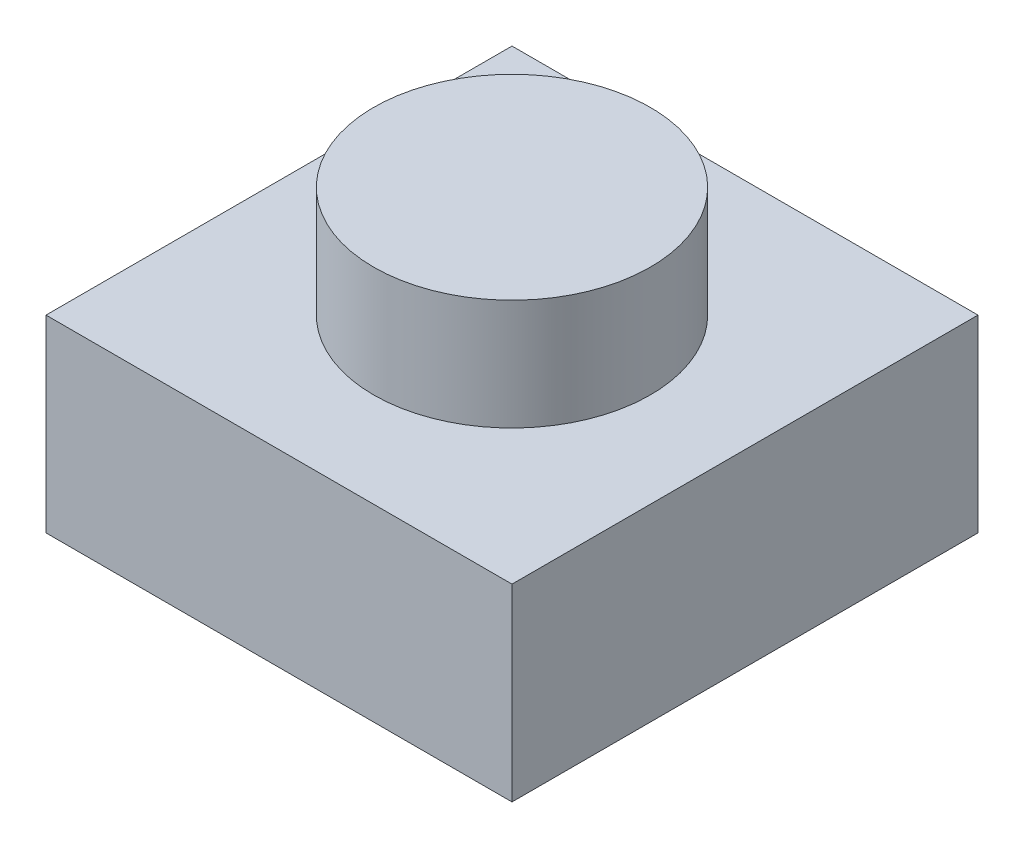
ISO-10303-21;
HEADER;
FILE_DESCRIPTION(('STEP AP214'),'2;1');
FILE_NAME('part.step','',(''),(''),'','','');
FILE_SCHEMA(('AUTOMOTIVE_DESIGN { 1 0 10303 214 1 1 1 1 }'));
ENDSEC;
DATA;
#1=APPLICATION_CONTEXT('core data for automotive mechanical design processes');
#2=APPLICATION_PROTOCOL_DEFINITION('international standard','automotive_design',2000,#1);
#3=PRODUCT_CONTEXT('',#1,'mechanical');
#4=PRODUCT('Part','Part','',(#3));
#5=PRODUCT_RELATED_PRODUCT_CATEGORY('part','',(#4));
#6=PRODUCT_DEFINITION_FORMATION('','',#4);
#7=PRODUCT_DEFINITION_CONTEXT('part definition',#1,'design');
#8=PRODUCT_DEFINITION('design','',#6,#7);
#9=PRODUCT_DEFINITION_SHAPE('','',#8);
#10=(LENGTH_UNIT() NAMED_UNIT(*) SI_UNIT(.MILLI.,.METRE.));
#11=(NAMED_UNIT(*) PLANE_ANGLE_UNIT() SI_UNIT($,.RADIAN.));
#12=(NAMED_UNIT(*) SI_UNIT($,.STERADIAN.) SOLID_ANGLE_UNIT());
#13=UNCERTAINTY_MEASURE_WITH_UNIT(LENGTH_MEASURE(1.E-05),#10,'distance_accuracy_value','');
#14=(GEOMETRIC_REPRESENTATION_CONTEXT(3) GLOBAL_UNCERTAINTY_ASSIGNED_CONTEXT((#13)) GLOBAL_UNIT_ASSIGNED_CONTEXT((#10,
#11,#12)) REPRESENTATION_CONTEXT('',''));
#15=CARTESIAN_POINT('',(0.,0.,0.));
#16=DIRECTION('',(0.,0.,1.));
#17=DIRECTION('',(1.,0.,0.));
#18=AXIS2_PLACEMENT_3D('',#15,#16,#17);
#19=CARTESIAN_POINT('',(3.915,-3.17,-3.91500000000003));
#20=DIRECTION('',(1.,0.,0.));
#21=DIRECTION('',(0.,0.,-1.));
#22=AXIS2_PLACEMENT_3D('',#19,#20,#21);
#23=PLANE('',#22);
#24=DIRECTION('',(0.,0.,-1.));
#25=VECTOR('',#24,1.);
#26=CARTESIAN_POINT('',(3.915,0.,-3.91500000000003));
#27=LINE('',#26,#25);
#28=CARTESIAN_POINT('',(3.91499999999997,0.,3.91499999999997));
#29=VERTEX_POINT('',#28);
#30=CARTESIAN_POINT('',(3.915,0.,-3.91500000000003));
#31=VERTEX_POINT('',#30);
#32=EDGE_CURVE('E154',#29,#31,#27,.T.);
#33=ORIENTED_EDGE('',*,*,#32,.F.);
#34=DIRECTION('',(0.,1.,0.));
#35=VECTOR('',#34,1.);
#36=CARTESIAN_POINT('',(3.91499999999997,-3.17,3.91499999999997));
#37=LINE('',#36,#35);
#38=CARTESIAN_POINT('',(3.91499999999997,-3.17,3.91499999999997));
#39=VERTEX_POINT('',#38);
#40=EDGE_CURVE('E41',#39,#29,#37,.T.);
#41=ORIENTED_EDGE('',*,*,#40,.F.);
#42=DIRECTION('',(0.,0.,-1.));
#43=VECTOR('',#42,1.);
#44=CARTESIAN_POINT('',(3.915,-3.17,-3.91500000000003));
#45=LINE('',#44,#43);
#46=CARTESIAN_POINT('',(3.915,-3.17,-3.91500000000003));
#47=VERTEX_POINT('',#46);
#48=EDGE_CURVE('E156',#39,#47,#45,.T.);
#49=ORIENTED_EDGE('',*,*,#48,.T.);
#50=DIRECTION('',(0.,1.,0.));
#51=VECTOR('',#50,1.);
#52=CARTESIAN_POINT('',(3.915,-3.17,-3.91500000000003));
#53=LINE('',#52,#51);
#54=EDGE_CURVE('E36',#47,#31,#53,.T.);
#55=ORIENTED_EDGE('',*,*,#54,.T.);
#56=EDGE_LOOP('',(#33,#41,#49,#55));
#57=FACE_BOUND('',#56,.T.);
#58=ADVANCED_FACE('F33',(#57),#23,.T.);
#59=CARTESIAN_POINT('',(-3.91500000000003,-3.17,3.91499999999997));
#60=DIRECTION('',(0.,0.,1.));
#61=DIRECTION('',(1.,0.,0.));
#62=AXIS2_PLACEMENT_3D('',#59,#60,#61);
#63=PLANE('',#62);
#64=DIRECTION('',(1.,0.,0.));
#65=VECTOR('',#64,1.);
#66=CARTESIAN_POINT('',(-3.91500000000003,0.,3.91499999999997));
#67=LINE('',#66,#65);
#68=CARTESIAN_POINT('',(-3.91500000000003,0.,3.91499999999997));
#69=VERTEX_POINT('',#68);
#70=EDGE_CURVE('E159',#69,#29,#67,.T.);
#71=ORIENTED_EDGE('',*,*,#70,.F.);
#72=DIRECTION('',(0.,1.,0.));
#73=VECTOR('',#72,1.);
#74=CARTESIAN_POINT('',(-3.91500000000003,-3.17,3.91499999999997));
#75=LINE('',#74,#73);
#76=CARTESIAN_POINT('',(-3.91500000000003,-3.17,3.91499999999997));
#77=VERTEX_POINT('',#76);
#78=EDGE_CURVE('E177',#77,#69,#75,.T.);
#79=ORIENTED_EDGE('',*,*,#78,.F.);
#80=DIRECTION('',(1.,0.,0.));
#81=VECTOR('',#80,1.);
#82=CARTESIAN_POINT('',(-3.91500000000003,-3.17,3.91499999999997));
#83=LINE('',#82,#81);
#84=EDGE_CURVE('E164',#77,#39,#83,.T.);
#85=ORIENTED_EDGE('',*,*,#84,.T.);
#86=ORIENTED_EDGE('',*,*,#40,.T.);
#87=EDGE_LOOP('',(#71,#79,#85,#86));
#88=FACE_BOUND('',#87,.T.);
#89=ADVANCED_FACE('F183',(#88),#63,.T.);
#90=CARTESIAN_POINT('',(-3.91500000000003,-3.17,-3.91500000000003));
#91=DIRECTION('',(-1.,0.,0.));
#92=DIRECTION('',(0.,0.,1.));
#93=AXIS2_PLACEMENT_3D('',#90,#91,#92);
#94=PLANE('',#93);
#95=DIRECTION('',(0.,0.,1.));
#96=VECTOR('',#95,1.);
#97=CARTESIAN_POINT('',(-3.91500000000003,0.,-3.91500000000003));
#98=LINE('',#97,#96);
#99=CARTESIAN_POINT('',(-3.91500000000003,0.,-3.91500000000003));
#100=VERTEX_POINT('',#99);
#101=EDGE_CURVE('E171',#100,#69,#98,.T.);
#102=ORIENTED_EDGE('',*,*,#101,.F.);
#103=DIRECTION('',(0.,1.,0.));
#104=VECTOR('',#103,1.);
#105=CARTESIAN_POINT('',(-3.91500000000003,-3.17,-3.91500000000003));
#106=LINE('',#105,#104);
#107=CARTESIAN_POINT('',(-3.91500000000003,-3.17,-3.91500000000003));
#108=VERTEX_POINT('',#107);
#109=EDGE_CURVE('E178',#108,#100,#106,.T.);
#110=ORIENTED_EDGE('',*,*,#109,.F.);
#111=DIRECTION('',(0.,0.,1.));
#112=VECTOR('',#111,1.);
#113=CARTESIAN_POINT('',(-3.91500000000003,-3.17,-3.91500000000003));
#114=LINE('',#113,#112);
#115=EDGE_CURVE('E161',#108,#77,#114,.T.);
#116=ORIENTED_EDGE('',*,*,#115,.T.);
#117=ORIENTED_EDGE('',*,*,#78,.T.);
#118=EDGE_LOOP('',(#102,#110,#116,#117));
#119=FACE_BOUND('',#118,.T.);
#120=ADVANCED_FACE('F187',(#119),#94,.T.);
#121=CARTESIAN_POINT('',(-3.91500000000003,-3.17,-3.91500000000003));
#122=DIRECTION('',(0.,0.,-1.));
#123=DIRECTION('',(-1.,0.,0.));
#124=AXIS2_PLACEMENT_3D('',#121,#122,#123);
#125=PLANE('',#124);
#126=DIRECTION('',(-1.,0.,0.));
#127=VECTOR('',#126,1.);
#128=CARTESIAN_POINT('',(-3.91500000000003,0.,-3.91500000000003));
#129=LINE('',#128,#127);
#130=EDGE_CURVE('E168',#31,#100,#129,.T.);
#131=ORIENTED_EDGE('',*,*,#130,.F.);
#132=ORIENTED_EDGE('',*,*,#54,.F.);
#133=DIRECTION('',(-1.,0.,0.));
#134=VECTOR('',#133,1.);
#135=CARTESIAN_POINT('',(-3.91500000000003,-3.17,-3.91500000000003));
#136=LINE('',#135,#134);
#137=EDGE_CURVE('E158',#47,#108,#136,.T.);
#138=ORIENTED_EDGE('',*,*,#137,.T.);
#139=ORIENTED_EDGE('',*,*,#109,.T.);
#140=EDGE_LOOP('',(#131,#132,#138,#139));
#141=FACE_BOUND('',#140,.T.);
#142=ADVANCED_FACE('F180',(#141),#125,.T.);
#143=CARTESIAN_POINT('',(0.,-3.17,0.));
#144=DIRECTION('',(0.,1.,0.));
#145=DIRECTION('',(0.,0.,1.));
#146=AXIS2_PLACEMENT_3D('',#143,#144,#145);
#147=PLANE('',#146);
#148=DIRECTION('',(1.,0.,0.));
#149=VECTOR('',#148,1.);
#150=CARTESIAN_POINT('',(0.,-3.17,2.46499999999997));
#151=LINE('',#150,#149);
#152=CARTESIAN_POINT('',(-2.46500000000003,-3.17,2.46499999999997));
#153=VERTEX_POINT('',#152);
#154=CARTESIAN_POINT('',(2.46499999999998,-3.17,2.46499999999997));
#155=VERTEX_POINT('',#154);
#156=EDGE_CURVE('E148',#153,#155,#151,.T.);
#157=ORIENTED_EDGE('',*,*,#156,.T.);
#158=DIRECTION('',(0.,0.,-1.));
#159=VECTOR('',#158,1.);
#160=CARTESIAN_POINT('',(2.46499999999999,-3.17,0.));
#161=LINE('',#160,#159);
#162=CARTESIAN_POINT('',(2.465,-3.17,-2.46500000000003));
#163=VERTEX_POINT('',#162);
#164=EDGE_CURVE('E111',#155,#163,#161,.T.);
#165=ORIENTED_EDGE('',*,*,#164,.T.);
#166=DIRECTION('',(-1.,0.,0.));
#167=VECTOR('',#166,1.);
#168=CARTESIAN_POINT('',(0.,-3.17,-2.46500000000003));
#169=LINE('',#168,#167);
#170=CARTESIAN_POINT('',(-2.46500000000003,-3.17,-2.46500000000003));
#171=VERTEX_POINT('',#170);
#172=EDGE_CURVE('E133',#163,#171,#169,.T.);
#173=ORIENTED_EDGE('',*,*,#172,.T.);
#174=DIRECTION('',(0.,0.,1.));
#175=VECTOR('',#174,1.);
#176=CARTESIAN_POINT('',(-2.46500000000003,-3.17,0.));
#177=LINE('',#176,#175);
#178=EDGE_CURVE('E49',#171,#153,#177,.T.);
#179=ORIENTED_EDGE('',*,*,#178,.T.);
#180=EDGE_LOOP('',(#157,#165,#173,#179));
#181=FACE_BOUND('',#180,.T.);
#182=ORIENTED_EDGE('',*,*,#48,.F.);
#183=ORIENTED_EDGE('',*,*,#84,.F.);
#184=ORIENTED_EDGE('',*,*,#115,.F.);
#185=ORIENTED_EDGE('',*,*,#137,.F.);
#186=EDGE_LOOP('',(#182,#183,#184,#185));
#187=FACE_BOUND('',#186,.T.);
#188=ADVANCED_FACE('F189',(#181,#187),#147,.F.);
#189=CARTESIAN_POINT('',(0.,0.,0.));
#190=DIRECTION('',(0.,1.,0.));
#191=DIRECTION('',(0.,0.,1.));
#192=AXIS2_PLACEMENT_3D('',#189,#190,#191);
#193=PLANE('',#192);
#194=CARTESIAN_POINT('',(0.,0.,0.));
#195=DIRECTION('',(0.,1.,0.));
#196=DIRECTION('',(0.,0.,1.));
#197=AXIS2_PLACEMENT_3D('',#194,#195,#196);
#198=CIRCLE('',#197,2.325);
#199=CARTESIAN_POINT('',(0.,0.,2.325));
#200=VERTEX_POINT('',#199);
#201=EDGE_CURVE('E11',#200,#200,#198,.T.);
#202=ORIENTED_EDGE('',*,*,#201,.F.);
#203=EDGE_LOOP('',(#202));
#204=FACE_BOUND('',#203,.T.);
#205=ORIENTED_EDGE('',*,*,#32,.T.);
#206=ORIENTED_EDGE('',*,*,#130,.T.);
#207=ORIENTED_EDGE('',*,*,#101,.T.);
#208=ORIENTED_EDGE('',*,*,#70,.T.);
#209=EDGE_LOOP('',(#205,#206,#207,#208));
#210=FACE_BOUND('',#209,.T.);
#211=ADVANCED_FACE('F182',(#204,#210),#193,.T.);
#212=CARTESIAN_POINT('',(0.,1.86,0.));
#213=DIRECTION('',(0.,-1.,0.));
#214=DIRECTION('',(0.,0.,-1.));
#215=AXIS2_PLACEMENT_3D('',#212,#213,#214);
#216=CYLINDRICAL_SURFACE('',#215,2.325);
#217=CARTESIAN_POINT('',(0.,1.86,0.));
#218=DIRECTION('',(0.,1.,0.));
#219=DIRECTION('',(0.,0.,1.));
#220=AXIS2_PLACEMENT_3D('',#217,#218,#219);
#221=CIRCLE('',#220,2.325);
#222=CARTESIAN_POINT('',(0.,1.86,2.325));
#223=VERTEX_POINT('',#222);
#224=EDGE_CURVE('E145',#223,#223,#221,.T.);
#225=ORIENTED_EDGE('',*,*,#224,.F.);
#226=EDGE_LOOP('',(#225));
#227=FACE_BOUND('',#226,.T.);
#228=ORIENTED_EDGE('',*,*,#201,.T.);
#229=EDGE_LOOP('',(#228));
#230=FACE_BOUND('',#229,.T.);
#231=ADVANCED_FACE('F197',(#227,#230),#216,.T.);
#232=CARTESIAN_POINT('',(0.,1.86,0.));
#233=DIRECTION('',(0.,1.,0.));
#234=DIRECTION('',(0.,0.,1.));
#235=AXIS2_PLACEMENT_3D('',#232,#233,#234);
#236=PLANE('',#235);
#237=ORIENTED_EDGE('',*,*,#224,.T.);
#238=EDGE_LOOP('',(#237));
#239=FACE_BOUND('',#238,.T.);
#240=ADVANCED_FACE('F232',(#239),#236,.T.);
#241=CARTESIAN_POINT('',(2.465,-3.17,-3.91500000000003));
#242=DIRECTION('',(1.,0.,0.));
#243=DIRECTION('',(0.,0.,-1.));
#244=AXIS2_PLACEMENT_3D('',#241,#242,#243);
#245=PLANE('',#244);
#246=DIRECTION('',(0.,0.,-1.));
#247=VECTOR('',#246,1.);
#248=CARTESIAN_POINT('',(2.46499999999999,-1.45,0.));
#249=LINE('',#248,#247);
#250=CARTESIAN_POINT('',(2.46499999999998,-1.45,2.46499999999997));
#251=VERTEX_POINT('',#250);
#252=CARTESIAN_POINT('',(2.465,-1.45,-2.46500000000003));
#253=VERTEX_POINT('',#252);
#254=EDGE_CURVE('E109',#251,#253,#249,.T.);
#255=ORIENTED_EDGE('',*,*,#254,.T.);
#256=DIRECTION('',(0.,1.,0.));
#257=VECTOR('',#256,1.);
#258=CARTESIAN_POINT('',(2.465,-3.17,-2.46500000000003));
#259=LINE('',#258,#257);
#260=EDGE_CURVE('E138',#163,#253,#259,.T.);
#261=ORIENTED_EDGE('',*,*,#260,.F.);
#262=ORIENTED_EDGE('',*,*,#164,.F.);
#263=DIRECTION('',(0.,1.,0.));
#264=VECTOR('',#263,1.);
#265=CARTESIAN_POINT('',(2.46499999999998,-3.17,2.46499999999997));
#266=LINE('',#265,#264);
#267=EDGE_CURVE('E106',#155,#251,#266,.T.);
#268=ORIENTED_EDGE('',*,*,#267,.T.);
#269=EDGE_LOOP('',(#255,#261,#262,#268));
#270=FACE_BOUND('',#269,.T.);
#271=ADVANCED_FACE('F108',(#270),#245,.F.);
#272=CARTESIAN_POINT('',(-3.91500000000003,-3.17,2.46499999999997));
#273=DIRECTION('',(0.,0.,1.));
#274=DIRECTION('',(1.,0.,0.));
#275=AXIS2_PLACEMENT_3D('',#272,#273,#274);
#276=PLANE('',#275);
#277=DIRECTION('',(1.,0.,0.));
#278=VECTOR('',#277,1.);
#279=CARTESIAN_POINT('',(0.,-1.45,2.46499999999997));
#280=LINE('',#279,#278);
#281=CARTESIAN_POINT('',(-2.46500000000003,-1.45,2.46499999999997));
#282=VERTEX_POINT('',#281);
#283=EDGE_CURVE('E124',#282,#251,#280,.T.);
#284=ORIENTED_EDGE('',*,*,#283,.T.);
#285=ORIENTED_EDGE('',*,*,#267,.F.);
#286=ORIENTED_EDGE('',*,*,#156,.F.);
#287=DIRECTION('',(0.,1.,0.));
#288=VECTOR('',#287,1.);
#289=CARTESIAN_POINT('',(-2.46500000000003,-3.17,2.46499999999997));
#290=LINE('',#289,#288);
#291=EDGE_CURVE('E117',#153,#282,#290,.T.);
#292=ORIENTED_EDGE('',*,*,#291,.T.);
#293=EDGE_LOOP('',(#284,#285,#286,#292));
#294=FACE_BOUND('',#293,.T.);
#295=ADVANCED_FACE('F129',(#294),#276,.F.);
#296=CARTESIAN_POINT('',(-2.46500000000003,-3.17,-3.91500000000003));
#297=DIRECTION('',(-1.,0.,0.));
#298=DIRECTION('',(0.,0.,1.));
#299=AXIS2_PLACEMENT_3D('',#296,#297,#298);
#300=PLANE('',#299);
#301=DIRECTION('',(0.,0.,1.));
#302=VECTOR('',#301,1.);
#303=CARTESIAN_POINT('',(-2.46500000000003,-1.45,0.));
#304=LINE('',#303,#302);
#305=CARTESIAN_POINT('',(-2.46500000000003,-1.45,-2.46500000000003));
#306=VERTEX_POINT('',#305);
#307=EDGE_CURVE('E131',#306,#282,#304,.T.);
#308=ORIENTED_EDGE('',*,*,#307,.T.);
#309=ORIENTED_EDGE('',*,*,#291,.F.);
#310=ORIENTED_EDGE('',*,*,#178,.F.);
#311=DIRECTION('',(0.,1.,0.));
#312=VECTOR('',#311,1.);
#313=CARTESIAN_POINT('',(-2.46500000000003,-3.17,-2.46500000000003));
#314=LINE('',#313,#312);
#315=EDGE_CURVE('E139',#171,#306,#314,.T.);
#316=ORIENTED_EDGE('',*,*,#315,.T.);
#317=EDGE_LOOP('',(#308,#309,#310,#316));
#318=FACE_BOUND('',#317,.T.);
#319=ADVANCED_FACE('F261',(#318),#300,.F.);
#320=CARTESIAN_POINT('',(-3.91500000000003,-3.17,-2.46500000000003));
#321=DIRECTION('',(0.,0.,-1.));
#322=DIRECTION('',(-1.,0.,0.));
#323=AXIS2_PLACEMENT_3D('',#320,#321,#322);
#324=PLANE('',#323);
#325=DIRECTION('',(-1.,0.,0.));
#326=VECTOR('',#325,1.);
#327=CARTESIAN_POINT('',(0.,-1.45,-2.46500000000003));
#328=LINE('',#327,#326);
#329=EDGE_CURVE('E126',#253,#306,#328,.T.);
#330=ORIENTED_EDGE('',*,*,#329,.T.);
#331=ORIENTED_EDGE('',*,*,#315,.F.);
#332=ORIENTED_EDGE('',*,*,#172,.F.);
#333=ORIENTED_EDGE('',*,*,#260,.T.);
#334=EDGE_LOOP('',(#330,#331,#332,#333));
#335=FACE_BOUND('',#334,.T.);
#336=ADVANCED_FACE('F270',(#335),#324,.F.);
#337=CARTESIAN_POINT('',(0.,-1.45,0.));
#338=DIRECTION('',(0.,1.,0.));
#339=DIRECTION('',(0.,0.,1.));
#340=AXIS2_PLACEMENT_3D('',#337,#338,#339);
#341=PLANE('',#340);
#342=CARTESIAN_POINT('',(0.,-1.45,0.));
#343=DIRECTION('',(0.,1.,0.));
#344=DIRECTION('',(0.,0.,1.));
#345=AXIS2_PLACEMENT_3D('',#342,#343,#344);
#346=CIRCLE('',#345,0.875);
#347=CARTESIAN_POINT('',(0.,-1.45,0.875));
#348=VERTEX_POINT('',#347);
#349=EDGE_CURVE('E116',#348,#348,#346,.T.);
#350=ORIENTED_EDGE('',*,*,#349,.T.);
#351=EDGE_LOOP('',(#350));
#352=FACE_BOUND('',#351,.T.);
#353=ORIENTED_EDGE('',*,*,#254,.F.);
#354=ORIENTED_EDGE('',*,*,#283,.F.);
#355=ORIENTED_EDGE('',*,*,#307,.F.);
#356=ORIENTED_EDGE('',*,*,#329,.F.);
#357=EDGE_LOOP('',(#353,#354,#355,#356));
#358=FACE_BOUND('',#357,.T.);
#359=ADVANCED_FACE('F122',(#352,#358),#341,.F.);
#360=CARTESIAN_POINT('',(0.,1.86,0.));
#361=DIRECTION('',(0.,-1.,0.));
#362=DIRECTION('',(0.,0.,-1.));
#363=AXIS2_PLACEMENT_3D('',#360,#361,#362);
#364=CYLINDRICAL_SURFACE('',#363,0.875);
#365=CARTESIAN_POINT('',(0.,0.41,0.));
#366=DIRECTION('',(0.,1.,0.));
#367=DIRECTION('',(0.,0.,1.));
#368=AXIS2_PLACEMENT_3D('',#365,#366,#367);
#369=CIRCLE('',#368,0.875);
#370=CARTESIAN_POINT('',(0.,0.41,0.875));
#371=VERTEX_POINT('',#370);
#372=EDGE_CURVE('E127',#371,#371,#369,.T.);
#373=ORIENTED_EDGE('',*,*,#372,.T.);
#374=EDGE_LOOP('',(#373));
#375=FACE_BOUND('',#374,.T.);
#376=ORIENTED_EDGE('',*,*,#349,.F.);
#377=EDGE_LOOP('',(#376));
#378=FACE_BOUND('',#377,.T.);
#379=ADVANCED_FACE('F288',(#375,#378),#364,.F.);
#380=CARTESIAN_POINT('',(0.,0.41,0.));
#381=DIRECTION('',(0.,1.,0.));
#382=DIRECTION('',(0.,0.,1.));
#383=AXIS2_PLACEMENT_3D('',#380,#381,#382);
#384=PLANE('',#383);
#385=ORIENTED_EDGE('',*,*,#372,.F.);
#386=EDGE_LOOP('',(#385));
#387=FACE_BOUND('',#386,.T.);
#388=ADVANCED_FACE('F298',(#387),#384,.F.);
#389=CLOSED_SHELL('',(#58,#89,#120,#142,#188,#211,#231,#240,#271,#295,#319,#336,#359,#379,#388));
#390=MANIFOLD_SOLID_BREP('B2',#389);
#391=ADVANCED_BREP_SHAPE_REPRESENTATION('',(#18,#390),#14);
#392=SHAPE_DEFINITION_REPRESENTATION(#9,#391);
ENDSEC;
END-ISO-10303-21;
